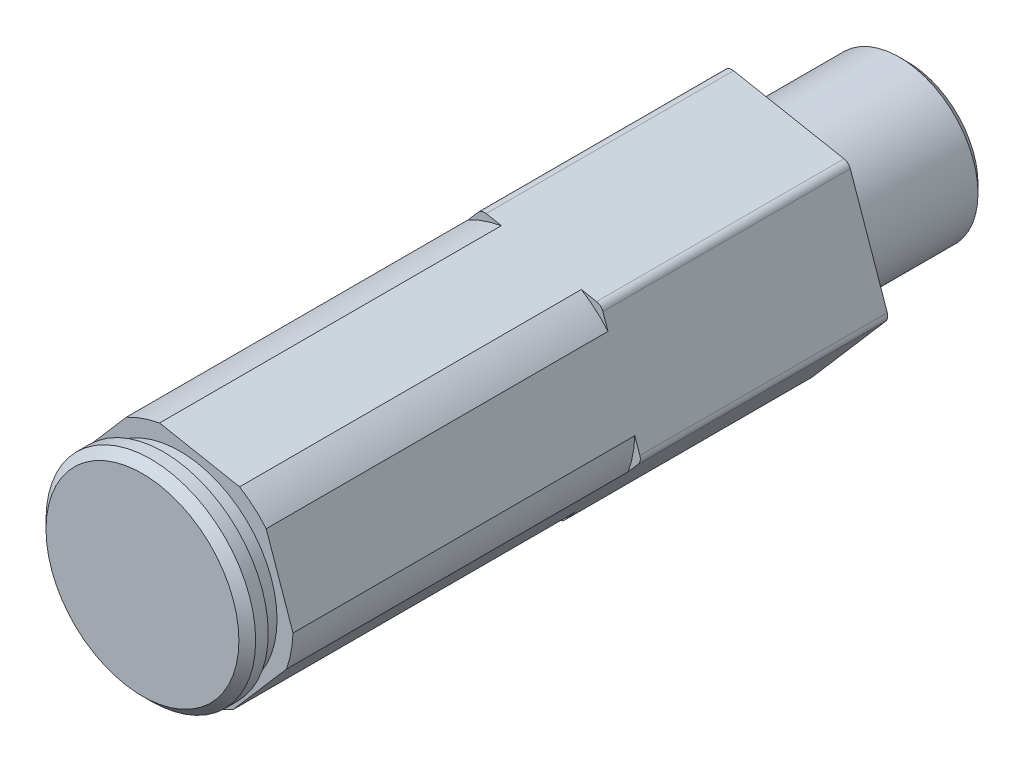
ISO-10303-21;
HEADER;
FILE_DESCRIPTION(('STEP AP214'),'2;1');
FILE_NAME('part.step','',(''),(''),'','','');
FILE_SCHEMA(('AUTOMOTIVE_DESIGN { 1 0 10303 214 1 1 1 1 }'));
ENDSEC;
DATA;
#1=APPLICATION_CONTEXT('core data for automotive mechanical design processes');
#2=APPLICATION_PROTOCOL_DEFINITION('international standard','automotive_design',2000,#1);
#3=PRODUCT_CONTEXT('',#1,'mechanical');
#4=PRODUCT('Part','Part','',(#3));
#5=PRODUCT_RELATED_PRODUCT_CATEGORY('part','',(#4));
#6=PRODUCT_DEFINITION_FORMATION('','',#4);
#7=PRODUCT_DEFINITION_CONTEXT('part definition',#1,'design');
#8=PRODUCT_DEFINITION('design','',#6,#7);
#9=PRODUCT_DEFINITION_SHAPE('','',#8);
#10=(LENGTH_UNIT() NAMED_UNIT(*) SI_UNIT(.MILLI.,.METRE.));
#11=(NAMED_UNIT(*) PLANE_ANGLE_UNIT() SI_UNIT($,.RADIAN.));
#12=(NAMED_UNIT(*) SI_UNIT($,.STERADIAN.) SOLID_ANGLE_UNIT());
#13=UNCERTAINTY_MEASURE_WITH_UNIT(LENGTH_MEASURE(1.E-05),#10,'distance_accuracy_value','');
#14=(GEOMETRIC_REPRESENTATION_CONTEXT(3) GLOBAL_UNCERTAINTY_ASSIGNED_CONTEXT((#13)) GLOBAL_UNIT_ASSIGNED_CONTEXT((#10,
#11,#12)) REPRESENTATION_CONTEXT('',''));
#15=CARTESIAN_POINT('',(0.,0.,0.));
#16=DIRECTION('',(0.,0.,1.));
#17=DIRECTION('',(1.,0.,0.));
#18=AXIS2_PLACEMENT_3D('',#15,#16,#17);
#19=CARTESIAN_POINT('',(0.,0.,23.1775));
#20=DIRECTION('',(0.,0.,1.));
#21=DIRECTION('',(1.,0.,0.));
#22=AXIS2_PLACEMENT_3D('',#19,#20,#21);
#23=CYLINDRICAL_SURFACE('',#22,6.862299966);
#24=CARTESIAN_POINT('',(0.,0.,0.215900000000002));
#25=DIRECTION('',(0.,0.,-1.));
#26=DIRECTION('',(-1.,0.,0.));
#27=AXIS2_PLACEMENT_3D('',#24,#25,#26);
#28=CIRCLE('',#27,6.862299966);
#29=CARTESIAN_POINT('',(6.85862382577054,-0.224588601527918,0.215900000000002));
#30=VERTEX_POINT('',#29);
#31=CARTESIAN_POINT('',(6.45951838185615,-2.31641600275643,0.215900000000005));
#32=VERTEX_POINT('',#31);
#33=EDGE_CURVE('E250',#30,#32,#28,.T.);
#34=ORIENTED_EDGE('',*,*,#33,.F.);
#35=DIRECTION('',(0.,0.,1.));
#36=VECTOR('',#35,1.);
#37=CARTESIAN_POINT('',(6.85862382577054,-0.224588601527918,23.1775));
#38=LINE('',#37,#36);
#39=CARTESIAN_POINT('',(6.85862382577054,-0.224588601527907,20.9169));
#40=VERTEX_POINT('',#39);
#41=EDGE_CURVE('E259',#40,#30,#38,.F.);
#42=ORIENTED_EDGE('',*,*,#41,.F.);
#43=CARTESIAN_POINT('',(0.,0.,20.9169));
#44=DIRECTION('',(0.,0.,1.));
#45=DIRECTION('',(1.,0.,0.));
#46=AXIS2_PLACEMENT_3D('',#43,#44,#45);
#47=CIRCLE('',#46,6.86229996599999);
#48=CARTESIAN_POINT('',(6.45951838185614,-2.31641600275644,20.9169));
#49=VERTEX_POINT('',#48);
#50=EDGE_CURVE('E309',#49,#40,#47,.T.);
#51=ORIENTED_EDGE('',*,*,#50,.F.);
#52=DIRECTION('',(0.,0.,1.));
#53=VECTOR('',#52,1.);
#54=CARTESIAN_POINT('',(6.45951838185615,-2.31641600275643,23.1775));
#55=LINE('',#54,#53);
#56=EDGE_CURVE('E295',#32,#49,#55,.T.);
#57=ORIENTED_EDGE('',*,*,#56,.F.);
#58=EDGE_LOOP('',(#34,#42,#51,#57));
#59=FACE_BOUND('',#58,.T.);
#60=ADVANCED_FACE('F38',(#59),#23,.T.);
#61=CARTESIAN_POINT('',(0.,0.,0.215900000000002));
#62=DIRECTION('',(0.,0.,-1.));
#63=DIRECTION('',(-1.,0.,0.));
#64=AXIS2_PLACEMENT_3D('',#61,#62,#63);
#65=CIRCLE('',#64,6.862299966);
#66=CARTESIAN_POINT('',(3.23481247856167,-6.05203676888246,0.215900000000002));
#67=VERTEX_POINT('',#66);
#68=CARTESIAN_POINT('',(1.2236840868082,-6.75231501627819,0.215900000000005));
#69=VERTEX_POINT('',#68);
#70=EDGE_CURVE('E247',#67,#69,#65,.T.);
#71=ORIENTED_EDGE('',*,*,#70,.F.);
#72=DIRECTION('',(0.,0.,1.));
#73=VECTOR('',#72,1.);
#74=CARTESIAN_POINT('',(3.23481247856167,-6.05203676888246,23.1775));
#75=LINE('',#74,#73);
#76=CARTESIAN_POINT('',(3.23481247856168,-6.05203676888245,20.9169));
#77=VERTEX_POINT('',#76);
#78=EDGE_CURVE('E292',#77,#67,#75,.F.);
#79=ORIENTED_EDGE('',*,*,#78,.F.);
#80=CARTESIAN_POINT('',(1.22368408680819,-6.75231501627819,20.9169));
#81=VERTEX_POINT('',#80);
#82=EDGE_CURVE('E475',#81,#77,#47,.T.);
#83=ORIENTED_EDGE('',*,*,#82,.F.);
#84=DIRECTION('',(0.,0.,1.));
#85=VECTOR('',#84,1.);
#86=CARTESIAN_POINT('',(1.2236840868082,-6.75231501627819,23.1775));
#87=LINE('',#86,#85);
#88=EDGE_CURVE('E288',#69,#81,#87,.T.);
#89=ORIENTED_EDGE('',*,*,#88,.F.);
#90=EDGE_LOOP('',(#71,#79,#83,#89));
#91=FACE_BOUND('',#90,.T.);
#92=ADVANCED_FACE('F504',(#91),#23,.T.);
#93=CARTESIAN_POINT('',(0.,0.,0.215900000000002));
#94=DIRECTION('',(0.,0.,-1.));
#95=DIRECTION('',(-1.,0.,0.));
#96=AXIS2_PLACEMENT_3D('',#93,#94,#95);
#97=CIRCLE('',#96,6.862299966);
#98=CARTESIAN_POINT('',(-3.62381134720887,-5.82744816735454,0.215900000000002));
#99=VERTEX_POINT('',#98);
#100=CARTESIAN_POINT('',(-5.23583429504795,-4.43589901352175,0.215900000000005));
#101=VERTEX_POINT('',#100);
#102=EDGE_CURVE('E244',#99,#101,#97,.T.);
#103=ORIENTED_EDGE('',*,*,#102,.F.);
#104=DIRECTION('',(0.,0.,1.));
#105=VECTOR('',#104,1.);
#106=CARTESIAN_POINT('',(-3.62381134720887,-5.82744816735454,23.1775));
#107=LINE('',#106,#105);
#108=CARTESIAN_POINT('',(-3.62381134720886,-5.82744816735454,20.9169));
#109=VERTEX_POINT('',#108);
#110=EDGE_CURVE('E285',#109,#99,#107,.F.);
#111=ORIENTED_EDGE('',*,*,#110,.F.);
#112=CARTESIAN_POINT('',(-5.23583429504795,-4.43589901352175,20.9169));
#113=VERTEX_POINT('',#112);
#114=EDGE_CURVE('E469',#113,#109,#47,.T.);
#115=ORIENTED_EDGE('',*,*,#114,.F.);
#116=DIRECTION('',(0.,0.,1.));
#117=VECTOR('',#116,1.);
#118=CARTESIAN_POINT('',(-5.23583429504795,-4.43589901352175,23.1775));
#119=LINE('',#118,#117);
#120=EDGE_CURVE('E280',#101,#113,#119,.T.);
#121=ORIENTED_EDGE('',*,*,#120,.F.);
#122=EDGE_LOOP('',(#103,#111,#115,#121));
#123=FACE_BOUND('',#122,.T.);
#124=ADVANCED_FACE('F474',(#123),#23,.T.);
#125=CARTESIAN_POINT('',(0.,0.,0.215900000000002));
#126=DIRECTION('',(0.,0.,-1.));
#127=DIRECTION('',(-1.,0.,0.));
#128=AXIS2_PLACEMENT_3D('',#125,#126,#127);
#129=CIRCLE('',#128,6.862299966);
#130=CARTESIAN_POINT('',(-6.85862382577054,0.224588601527911,0.215900000000002));
#131=VERTEX_POINT('',#130);
#132=CARTESIAN_POINT('',(-6.45951838185614,2.31641600275644,0.215900000000005));
#133=VERTEX_POINT('',#132);
#134=EDGE_CURVE('E225',#131,#133,#129,.T.);
#135=ORIENTED_EDGE('',*,*,#134,.F.);
#136=DIRECTION('',(0.,0.,1.));
#137=VECTOR('',#136,1.);
#138=CARTESIAN_POINT('',(-6.85862382577054,0.224588601527911,23.1775));
#139=LINE('',#138,#137);
#140=CARTESIAN_POINT('',(-6.85862382577053,0.224588601527908,20.9169));
#141=VERTEX_POINT('',#140);
#142=EDGE_CURVE('E277',#141,#131,#139,.F.);
#143=ORIENTED_EDGE('',*,*,#142,.F.);
#144=CARTESIAN_POINT('',(-6.45951838185614,2.31641600275645,20.9169));
#145=VERTEX_POINT('',#144);
#146=EDGE_CURVE('E472',#145,#141,#47,.T.);
#147=ORIENTED_EDGE('',*,*,#146,.F.);
#148=DIRECTION('',(0.,0.,1.));
#149=VECTOR('',#148,1.);
#150=CARTESIAN_POINT('',(-6.45951838185614,2.31641600275644,23.1775));
#151=LINE('',#150,#149);
#152=EDGE_CURVE('E272',#133,#145,#151,.T.);
#153=ORIENTED_EDGE('',*,*,#152,.F.);
#154=EDGE_LOOP('',(#135,#143,#147,#153));
#155=FACE_BOUND('',#154,.T.);
#156=ADVANCED_FACE('F518',(#155),#23,.T.);
#157=CARTESIAN_POINT('',(0.,0.,0.215900000000002));
#158=DIRECTION('',(0.,0.,-1.));
#159=DIRECTION('',(-1.,0.,0.));
#160=AXIS2_PLACEMENT_3D('',#157,#158,#159);
#161=CIRCLE('',#160,6.862299966);
#162=CARTESIAN_POINT('',(-3.23481247856168,6.05203676888246,0.215900000000002));
#163=VERTEX_POINT('',#162);
#164=CARTESIAN_POINT('',(-1.22368408680818,6.75231501627819,0.215900000000005));
#165=VERTEX_POINT('',#164);
#166=EDGE_CURVE('E208',#163,#165,#161,.T.);
#167=ORIENTED_EDGE('',*,*,#166,.F.);
#168=DIRECTION('',(0.,0.,1.));
#169=VECTOR('',#168,1.);
#170=CARTESIAN_POINT('',(-3.23481247856168,6.05203676888246,23.1775));
#171=LINE('',#170,#169);
#172=CARTESIAN_POINT('',(-3.23481247856169,6.05203676888245,20.9169));
#173=VERTEX_POINT('',#172);
#174=EDGE_CURVE('E270',#173,#163,#171,.F.);
#175=ORIENTED_EDGE('',*,*,#174,.F.);
#176=CARTESIAN_POINT('',(-1.22368408680818,6.75231501627819,20.9169));
#177=VERTEX_POINT('',#176);
#178=EDGE_CURVE('E211',#177,#173,#47,.T.);
#179=ORIENTED_EDGE('',*,*,#178,.F.);
#180=DIRECTION('',(0.,0.,1.));
#181=VECTOR('',#180,1.);
#182=CARTESIAN_POINT('',(-1.22368408680819,6.75231501627819,23.1775));
#183=LINE('',#182,#181);
#184=EDGE_CURVE('E204',#165,#177,#183,.T.);
#185=ORIENTED_EDGE('',*,*,#184,.F.);
#186=EDGE_LOOP('',(#167,#175,#179,#185));
#187=FACE_BOUND('',#186,.T.);
#188=ADVANCED_FACE('F206',(#187),#23,.T.);
#189=CARTESIAN_POINT('',(0.,0.,0.215900000000002));
#190=DIRECTION('',(0.,0.,-1.));
#191=DIRECTION('',(-1.,0.,0.));
#192=AXIS2_PLACEMENT_3D('',#189,#190,#191);
#193=CIRCLE('',#192,6.862299966);
#194=CARTESIAN_POINT('',(3.62381134720886,5.82744816735455,0.215900000000002));
#195=VERTEX_POINT('',#194);
#196=CARTESIAN_POINT('',(5.23583429504795,4.43589901352176,0.215900000000005));
#197=VERTEX_POINT('',#196);
#198=EDGE_CURVE('E226',#195,#197,#193,.T.);
#199=ORIENTED_EDGE('',*,*,#198,.F.);
#200=DIRECTION('',(0.,0.,1.));
#201=VECTOR('',#200,1.);
#202=CARTESIAN_POINT('',(3.62381134720886,5.82744816735455,23.1775));
#203=LINE('',#202,#201);
#204=CARTESIAN_POINT('',(3.62381134720885,5.82744816735455,20.9169));
#205=VERTEX_POINT('',#204);
#206=EDGE_CURVE('E216',#205,#195,#203,.F.);
#207=ORIENTED_EDGE('',*,*,#206,.F.);
#208=CARTESIAN_POINT('',(5.23583429504795,4.43589901352175,20.9169));
#209=VERTEX_POINT('',#208);
#210=EDGE_CURVE('E310',#209,#205,#47,.T.);
#211=ORIENTED_EDGE('',*,*,#210,.F.);
#212=DIRECTION('',(0.,0.,1.));
#213=VECTOR('',#212,1.);
#214=CARTESIAN_POINT('',(5.23583429504795,4.43589901352176,23.1775));
#215=LINE('',#214,#213);
#216=EDGE_CURVE('E262',#197,#209,#215,.T.);
#217=ORIENTED_EDGE('',*,*,#216,.F.);
#218=EDGE_LOOP('',(#199,#207,#211,#217));
#219=FACE_BOUND('',#218,.T.);
#220=ADVANCED_FACE('F486',(#219),#23,.T.);
#221=CARTESIAN_POINT('',(0.,4.7625,-14.7701));
#222=DIRECTION('',(0.,0.,1.));
#223=DIRECTION('',(1.,0.,0.));
#224=AXIS2_PLACEMENT_3D('',#221,#222,#223);
#225=PLANE('',#224);
#226=CARTESIAN_POINT('',(0.,0.,-14.7701));
#227=DIRECTION('',(0.,0.,1.));
#228=DIRECTION('',(1.,0.,0.));
#229=AXIS2_PLACEMENT_3D('',#226,#227,#228);
#230=CIRCLE('',#229,4.7625);
#231=CARTESIAN_POINT('',(4.7625,0.,-14.7701));
#232=VERTEX_POINT('',#231);
#233=EDGE_CURVE('E313',#232,#232,#230,.T.);
#234=ORIENTED_EDGE('',*,*,#233,.T.);
#235=EDGE_LOOP('',(#234));
#236=FACE_BOUND('',#235,.T.);
#237=DIRECTION('',(-0.328837014120275,0.944386688885682,0.));
#238=VECTOR('',#237,1.);
#239=CARTESIAN_POINT('',(4.56823802416892,6.35316806990992,-14.7701));
#240=LINE('',#239,#238);
#241=CARTESIAN_POINT('',(7.1664837579922,-1.10873123008568,-14.7701));
#242=VERTEX_POINT('',#241);
#243=CARTESIAN_POINT('',(4.92797436282629,5.32004164207953,-14.7701));
#244=VERTEX_POINT('',#243);
#245=EDGE_CURVE('E264',#242,#244,#240,.T.);
#246=ORIENTED_EDGE('',*,*,#245,.F.);
#247=CARTESIAN_POINT('',(6.68673532003827,-1.27578043325878,-14.7701));
#248=DIRECTION('',(0.,0.,1.));
#249=DIRECTION('',(1.,0.,0.));
#250=AXIS2_PLACEMENT_3D('',#247,#248,#249);
#251=CIRCLE('',#250,0.508);
#252=CARTESIAN_POINT('',(7.07127839264509,-1.60773016636624,-14.7701));
#253=VERTEX_POINT('',#252);
#254=EDGE_CURVE('E355',#242,#253,#251,.F.);
#255=ORIENTED_EDGE('',*,*,#254,.T.);
#256=DIRECTION('',(0.653444356510735,0.756974552375621,0.));
#257=VECTOR('',#256,1.);
#258=CARTESIAN_POINT('',(7.20289199861723,-1.45526400842235,-14.7701));
#259=LINE('',#258,#257);
#260=CARTESIAN_POINT('',(2.62305246777273,-6.76072260527266,-14.7701));
#261=VERTEX_POINT('',#260);
#262=EDGE_CURVE('E297',#261,#253,#259,.T.);
#263=ORIENTED_EDGE('',*,*,#262,.F.);
#264=CARTESIAN_POINT('',(2.23850939516591,-6.4287728721652,-14.7701));
#265=DIRECTION('',(0.,0.,1.));
#266=DIRECTION('',(1.,0.,0.));
#267=AXIS2_PLACEMENT_3D('',#264,#265,#266);
#268=CIRCLE('',#267,0.508);
#269=CARTESIAN_POINT('',(2.1433040298188,-6.92777180844576,-14.7701));
#270=VERTEX_POINT('',#269);
#271=EDGE_CURVE('E347',#261,#270,#268,.F.);
#272=ORIENTED_EDGE('',*,*,#271,.T.);
#273=DIRECTION('',(0.982281370631009,-0.187412136510061,0.));
#274=VECTOR('',#273,1.);
#275=CARTESIAN_POINT('',(-2.07679916236833,-6.12260683312646,-14.7701));
#276=LINE('',#275,#274);
#277=CARTESIAN_POINT('',(-4.54343129021947,-5.65199137518697,-14.7701));
#278=VERTEX_POINT('',#277);
#279=EDGE_CURVE('E290',#278,#270,#276,.T.);
#280=ORIENTED_EDGE('',*,*,#279,.F.);
#281=CARTESIAN_POINT('',(-4.44822592487236,-5.15299243890642,-14.7701));
#282=DIRECTION('',(0.,0.,1.));
#283=DIRECTION('',(1.,0.,0.));
#284=AXIS2_PLACEMENT_3D('',#281,#282,#283);
#285=CIRCLE('',#284,0.508);
#286=CARTESIAN_POINT('',(-4.92797436282629,-5.32004164207952,-14.7701));
#287=VERTEX_POINT('',#286);
#288=EDGE_CURVE('E349',#278,#287,#285,.F.);
#289=ORIENTED_EDGE('',*,*,#288,.T.);
#290=DIRECTION('',(0.328837014120275,-0.944386688885682,0.));
#291=VECTOR('',#290,1.);
#292=CARTESIAN_POINT('',(-7.52622009664957,2.14185765791608,-14.7701));
#293=LINE('',#292,#291);
#294=CARTESIAN_POINT('',(-7.1664837579922,1.10873123008569,-14.7701));
#295=VERTEX_POINT('',#294);
#296=EDGE_CURVE('E282',#295,#287,#293,.T.);
#297=ORIENTED_EDGE('',*,*,#296,.F.);
#298=CARTESIAN_POINT('',(-6.68673532003828,1.27578043325878,-14.7701));
#299=DIRECTION('',(0.,0.,1.));
#300=DIRECTION('',(1.,0.,0.));
#301=AXIS2_PLACEMENT_3D('',#298,#299,#300);
#302=CIRCLE('',#301,0.508);
#303=CARTESIAN_POINT('',(-7.07127839264509,1.60773016636624,-14.7701));
#304=VERTEX_POINT('',#303);
#305=EDGE_CURVE('E351',#295,#304,#302,.F.);
#306=ORIENTED_EDGE('',*,*,#305,.T.);
#307=DIRECTION('',(-0.653444356510735,-0.756974552375621,0.));
#308=VECTOR('',#307,1.);
#309=CARTESIAN_POINT('',(-2.49143886180059,6.91318876321654,-14.7701));
#310=LINE('',#309,#308);
#311=CARTESIAN_POINT('',(-2.62305246777273,6.76072260527266,-14.7701));
#312=VERTEX_POINT('',#311);
#313=EDGE_CURVE('E274',#312,#304,#310,.T.);
#314=ORIENTED_EDGE('',*,*,#313,.F.);
#315=CARTESIAN_POINT('',(-2.23850939516591,6.42877287216521,-14.7701));
#316=DIRECTION('',(0.,0.,1.));
#317=DIRECTION('',(1.,0.,0.));
#318=AXIS2_PLACEMENT_3D('',#315,#316,#317);
#319=CIRCLE('',#318,0.508);
#320=CARTESIAN_POINT('',(-2.1433040298188,6.92777180844576,-14.7701));
#321=VERTEX_POINT('',#320);
#322=EDGE_CURVE('E353',#312,#321,#319,.F.);
#323=ORIENTED_EDGE('',*,*,#322,.T.);
#324=DIRECTION('',(-0.982281370631009,0.187412136510061,0.));
#325=VECTOR('',#324,1.);
#326=CARTESIAN_POINT('',(0.323328098032339,6.45715635050627,-14.7701));
#327=LINE('',#326,#325);
#328=CARTESIAN_POINT('',(4.54343129021947,5.65199137518698,-14.7701));
#329=VERTEX_POINT('',#328);
#330=EDGE_CURVE('E215',#329,#321,#327,.T.);
#331=ORIENTED_EDGE('',*,*,#330,.F.);
#332=CARTESIAN_POINT('',(4.44822592487236,5.15299243890643,-14.7701));
#333=DIRECTION('',(0.,0.,1.));
#334=DIRECTION('',(1.,0.,0.));
#335=AXIS2_PLACEMENT_3D('',#332,#333,#334);
#336=CIRCLE('',#335,0.508);
#337=EDGE_CURVE('E345',#329,#244,#336,.F.);
#338=ORIENTED_EDGE('',*,*,#337,.T.);
#339=EDGE_LOOP('',(#246,#255,#263,#272,#280,#289,#297,#306,#314,#323,#331,#338));
#340=FACE_BOUND('',#339,.T.);
#341=ADVANCED_FACE('F405',(#236,#340),#225,.F.);
#342=CARTESIAN_POINT('',(0.,6.86229996599999,20.9169));
#343=DIRECTION('',(0.,0.,-1.));
#344=DIRECTION('',(-1.,0.,0.));
#345=AXIS2_PLACEMENT_3D('',#342,#343,#344);
#346=PLANE('',#345);
#347=CARTESIAN_POINT('',(0.,0.,20.9169));
#348=DIRECTION('',(0.,0.,1.));
#349=DIRECTION('',(1.,0.,0.));
#350=AXIS2_PLACEMENT_3D('',#347,#348,#349);
#351=CIRCLE('',#350,5.8928);
#352=CARTESIAN_POINT('',(5.8928,0.,20.9169));
#353=VERTEX_POINT('',#352);
#354=EDGE_CURVE('E306',#353,#353,#351,.T.);
#355=ORIENTED_EDGE('',*,*,#354,.F.);
#356=EDGE_LOOP('',(#355));
#357=FACE_BOUND('',#356,.T.);
#358=DIRECTION('',(-0.653444356510735,-0.756974552375621,0.));
#359=VECTOR('',#358,1.);
#360=CARTESIAN_POINT('',(8.24153862712098,-0.252056636816328,20.9169));
#361=LINE('',#360,#359);
#362=EDGE_CURVE('E326',#49,#77,#361,.T.);
#363=ORIENTED_EDGE('',*,*,#362,.F.);
#364=ORIENTED_EDGE('',*,*,#50,.T.);
#365=DIRECTION('',(0.328837014120275,-0.944386688885682,0.));
#366=VECTOR('',#365,1.);
#367=CARTESIAN_POINT('',(3.91614661679637,8.2259087244462,20.9169));
#368=LINE('',#367,#366);
#369=EDGE_CURVE('E316',#209,#40,#368,.T.);
#370=ORIENTED_EDGE('',*,*,#369,.F.);
#371=ORIENTED_EDGE('',*,*,#210,.T.);
#372=DIRECTION('',(0.982281370631009,-0.187412136510061,0.));
#373=VECTOR('',#372,1.);
#374=CARTESIAN_POINT('',(-0.0632271230988614,6.53090827336396,20.9169));
#375=LINE('',#374,#373);
#376=EDGE_CURVE('E318',#177,#205,#375,.T.);
#377=ORIENTED_EDGE('',*,*,#376,.F.);
#378=ORIENTED_EDGE('',*,*,#178,.T.);
#379=DIRECTION('',(0.653444356510735,0.756974552375621,0.));
#380=VECTOR('',#379,1.);
#381=CARTESIAN_POINT('',(-1.45279223329684,8.11639613482257,20.9169));
#382=LINE('',#381,#380);
#383=EDGE_CURVE('E320',#145,#173,#382,.T.);
#384=ORIENTED_EDGE('',*,*,#383,.F.);
#385=ORIENTED_EDGE('',*,*,#146,.T.);
#386=DIRECTION('',(-0.328837014120275,0.944386688885682,0.));
#387=VECTOR('',#386,1.);
#388=CARTESIAN_POINT('',(-8.17831150402212,4.01459831245237,20.9169));
#389=LINE('',#388,#387);
#390=EDGE_CURVE('E322',#113,#141,#389,.T.);
#391=ORIENTED_EDGE('',*,*,#390,.F.);
#392=ORIENTED_EDGE('',*,*,#114,.T.);
#393=DIRECTION('',(-0.982281370631009,0.187412136510061,0.));
#394=VECTOR('',#393,1.);
#395=CARTESIAN_POINT('',(-2.46335438349953,-6.04885491026878,20.9169));
#396=LINE('',#395,#394);
#397=EDGE_CURVE('E324',#81,#109,#396,.T.);
#398=ORIENTED_EDGE('',*,*,#397,.F.);
#399=ORIENTED_EDGE('',*,*,#82,.T.);
#400=EDGE_LOOP('',(#363,#364,#370,#371,#377,#378,#384,#385,#391,#392,#398,#399));
#401=FACE_BOUND('',#400,.T.);
#402=ADVANCED_FACE('F467',(#357,#401),#346,.F.);
#403=CARTESIAN_POINT('',(0.,6.35,23.1775));
#404=DIRECTION('',(0.,0.,-1.));
#405=DIRECTION('',(-1.,0.,0.));
#406=AXIS2_PLACEMENT_3D('',#403,#404,#405);
#407=PLANE('',#406);
#408=CARTESIAN_POINT('',(0.,0.,23.1775));
#409=DIRECTION('',(0.,0.,-1.));
#410=DIRECTION('',(-1.,0.,0.));
#411=AXIS2_PLACEMENT_3D('',#408,#409,#410);
#412=CIRCLE('',#411,5.84199999999999);
#413=CARTESIAN_POINT('',(-5.84199999999999,0.,23.1775));
#414=VERTEX_POINT('',#413);
#415=EDGE_CURVE('E334',#414,#414,#412,.F.);
#416=ORIENTED_EDGE('',*,*,#415,.T.);
#417=EDGE_LOOP('',(#416));
#418=FACE_BOUND('',#417,.T.);
#419=ADVANCED_FACE('F741',(#418),#407,.F.);
#420=CARTESIAN_POINT('',(0.,0.,-23.1775));
#421=DIRECTION('',(0.,0.,1.));
#422=DIRECTION('',(1.,0.,0.));
#423=AXIS2_PLACEMENT_3D('',#420,#421,#422);
#424=PLANE('',#423);
#425=CARTESIAN_POINT('',(0.,0.,-23.1775));
#426=DIRECTION('',(0.,0.,1.));
#427=DIRECTION('',(1.,0.,0.));
#428=AXIS2_PLACEMENT_3D('',#425,#426,#427);
#429=CIRCLE('',#428,4.25450000000001);
#430=CARTESIAN_POINT('',(4.25450000000001,0.,-23.1775));
#431=VERTEX_POINT('',#430);
#432=EDGE_CURVE('E331',#431,#431,#429,.F.);
#433=ORIENTED_EDGE('',*,*,#432,.T.);
#434=EDGE_LOOP('',(#433));
#435=FACE_BOUND('',#434,.T.);
#436=CARTESIAN_POINT('',(0.,0.,-23.1775));
#437=DIRECTION('',(0.,0.,-1.));
#438=DIRECTION('',(-1.,0.,0.));
#439=AXIS2_PLACEMENT_3D('',#436,#437,#438);
#440=CIRCLE('',#439,3.175);
#441=CARTESIAN_POINT('',(-3.175,0.,-23.1775));
#442=VERTEX_POINT('',#441);
#443=EDGE_CURVE('E253',#442,#442,#440,.T.);
#444=ORIENTED_EDGE('',*,*,#443,.F.);
#445=EDGE_LOOP('',(#444));
#446=FACE_BOUND('',#445,.T.);
#447=ADVANCED_FACE('F746',(#435,#446),#424,.F.);
#448=CARTESIAN_POINT('',(0.,0.,23.1775));
#449=DIRECTION('',(0.,0.,1.));
#450=DIRECTION('',(1.,0.,0.));
#451=AXIS2_PLACEMENT_3D('',#448,#449,#450);
#452=CYLINDRICAL_SURFACE('',#451,4.7625);
#453=CARTESIAN_POINT('',(0.,0.,-22.6695));
#454=DIRECTION('',(0.,0.,1.));
#455=DIRECTION('',(1.,0.,0.));
#456=AXIS2_PLACEMENT_3D('',#453,#454,#455);
#457=CIRCLE('',#456,4.7625);
#458=CARTESIAN_POINT('',(4.7625,0.,-22.6695));
#459=VERTEX_POINT('',#458);
#460=EDGE_CURVE('E328',#459,#459,#457,.T.);
#461=ORIENTED_EDGE('',*,*,#460,.T.);
#462=EDGE_LOOP('',(#461));
#463=FACE_BOUND('',#462,.T.);
#464=ORIENTED_EDGE('',*,*,#233,.F.);
#465=EDGE_LOOP('',(#464));
#466=FACE_BOUND('',#465,.T.);
#467=ADVANCED_FACE('F756',(#463,#466),#452,.T.);
#468=CARTESIAN_POINT('',(0.,0.,23.1775));
#469=DIRECTION('',(0.,0.,1.));
#470=DIRECTION('',(1.,0.,0.));
#471=AXIS2_PLACEMENT_3D('',#468,#469,#470);
#472=CYLINDRICAL_SURFACE('',#471,5.8928);
#473=CARTESIAN_POINT('',(0.,0.,21.9075));
#474=DIRECTION('',(0.,0.,1.));
#475=DIRECTION('',(1.,0.,0.));
#476=AXIS2_PLACEMENT_3D('',#473,#474,#475);
#477=CIRCLE('',#476,5.8928);
#478=CARTESIAN_POINT('',(5.8928,0.,21.9075));
#479=VERTEX_POINT('',#478);
#480=EDGE_CURVE('E303',#479,#479,#477,.T.);
#481=ORIENTED_EDGE('',*,*,#480,.F.);
#482=EDGE_LOOP('',(#481));
#483=FACE_BOUND('',#482,.T.);
#484=ORIENTED_EDGE('',*,*,#354,.T.);
#485=EDGE_LOOP('',(#484));
#486=FACE_BOUND('',#485,.T.);
#487=ADVANCED_FACE('F766',(#483,#486),#472,.T.);
#488=CARTESIAN_POINT('',(0.,5.8928,21.9075));
#489=DIRECTION('',(0.,0.,1.));
#490=DIRECTION('',(1.,0.,0.));
#491=AXIS2_PLACEMENT_3D('',#488,#489,#490);
#492=PLANE('',#491);
#493=CARTESIAN_POINT('',(0.,0.,21.9075));
#494=DIRECTION('',(0.,0.,1.));
#495=DIRECTION('',(1.,0.,0.));
#496=AXIS2_PLACEMENT_3D('',#493,#494,#495);
#497=CIRCLE('',#496,6.35);
#498=CARTESIAN_POINT('',(6.35,0.,21.9075));
#499=VERTEX_POINT('',#498);
#500=EDGE_CURVE('E300',#499,#499,#497,.T.);
#501=ORIENTED_EDGE('',*,*,#500,.F.);
#502=EDGE_LOOP('',(#501));
#503=FACE_BOUND('',#502,.T.);
#504=ORIENTED_EDGE('',*,*,#480,.T.);
#505=EDGE_LOOP('',(#504));
#506=FACE_BOUND('',#505,.T.);
#507=ADVANCED_FACE('F777',(#503,#506),#492,.F.);
#508=CARTESIAN_POINT('',(0.,0.,23.1775));
#509=DIRECTION('',(0.,0.,1.));
#510=DIRECTION('',(1.,0.,0.));
#511=AXIS2_PLACEMENT_3D('',#508,#509,#510);
#512=CYLINDRICAL_SURFACE('',#511,6.35);
#513=CARTESIAN_POINT('',(0.,0.,22.6695));
#514=DIRECTION('',(0.,0.,-1.));
#515=DIRECTION('',(-1.,0.,0.));
#516=AXIS2_PLACEMENT_3D('',#513,#514,#515);
#517=CIRCLE('',#516,6.35);
#518=CARTESIAN_POINT('',(-6.35,0.,22.6695));
#519=VERTEX_POINT('',#518);
#520=EDGE_CURVE('E337',#519,#519,#517,.T.);
#521=ORIENTED_EDGE('',*,*,#520,.T.);
#522=EDGE_LOOP('',(#521));
#523=FACE_BOUND('',#522,.T.);
#524=ORIENTED_EDGE('',*,*,#500,.T.);
#525=EDGE_LOOP('',(#524));
#526=FACE_BOUND('',#525,.T.);
#527=ADVANCED_FACE('F667',(#523,#526),#512,.T.);
#528=CARTESIAN_POINT('',(7.2629296604121,-1.38571411988168,-23.1775));
#529=DIRECTION('',(0.944386688885682,0.328837014120275,0.));
#530=DIRECTION('',(-0.328837014120275,0.944386688885682,0.));
#531=AXIS2_PLACEMENT_3D('',#528,#529,#530);
#532=PLANE('',#531);
#533=DIRECTION('',(-0.328837014120275,0.944386688885682,0.));
#534=VECTOR('',#533,1.);
#535=CARTESIAN_POINT('',(4.83152846040639,5.59702453187553,0.215900000000005));
#536=LINE('',#535,#534);
#537=CARTESIAN_POINT('',(7.1664837579922,-1.10873123008568,0.215900000000005));
#538=VERTEX_POINT('',#537);
#539=EDGE_CURVE('E240',#538,#30,#536,.T.);
#540=ORIENTED_EDGE('',*,*,#539,.F.);
#541=DIRECTION('',(0.,0.,-1.));
#542=VECTOR('',#541,1.);
#543=CARTESIAN_POINT('',(7.1664837579922,-1.10873123008568,-23.1775));
#544=LINE('',#543,#542);
#545=EDGE_CURVE('E342',#538,#242,#544,.T.);
#546=ORIENTED_EDGE('',*,*,#545,.T.);
#547=ORIENTED_EDGE('',*,*,#245,.T.);
#548=DIRECTION('',(0.,0.,-1.));
#549=VECTOR('',#548,1.);
#550=CARTESIAN_POINT('',(4.92797436282629,5.32004164207953,-23.1775));
#551=LINE('',#550,#549);
#552=CARTESIAN_POINT('',(4.92797436282629,5.32004164207953,0.215900000000005));
#553=VERTEX_POINT('',#552);
#554=EDGE_CURVE('E340',#244,#553,#551,.F.);
#555=ORIENTED_EDGE('',*,*,#554,.T.);
#556=EDGE_CURVE('E234',#197,#553,#536,.T.);
#557=ORIENTED_EDGE('',*,*,#556,.F.);
#558=ORIENTED_EDGE('',*,*,#216,.T.);
#559=ORIENTED_EDGE('',*,*,#369,.T.);
#560=ORIENTED_EDGE('',*,*,#41,.T.);
#561=EDGE_LOOP('',(#540,#546,#547,#555,#557,#558,#559,#560));
#562=FACE_BOUND('',#561,.T.);
#563=ADVANCED_FACE('F439',(#562),#532,.T.);
#564=CARTESIAN_POINT('',(4.83152846040638,5.59702453187553,-23.1775));
#565=DIRECTION('',(0.187412136510061,0.982281370631009,0.));
#566=DIRECTION('',(-0.982281370631009,0.187412136510061,0.));
#567=AXIS2_PLACEMENT_3D('',#564,#565,#566);
#568=PLANE('',#567);
#569=ORIENTED_EDGE('',*,*,#330,.T.);
#570=DIRECTION('',(0.,0.,-1.));
#571=VECTOR('',#570,1.);
#572=CARTESIAN_POINT('',(-2.1433040298188,6.92777180844576,-23.1775));
#573=LINE('',#572,#571);
#574=CARTESIAN_POINT('',(-2.1433040298188,6.92777180844576,0.215900000000005));
#575=VERTEX_POINT('',#574);
#576=EDGE_CURVE('E231',#321,#575,#573,.F.);
#577=ORIENTED_EDGE('',*,*,#576,.T.);
#578=DIRECTION('',(-0.982281370631009,0.187412136510061,0.));
#579=VECTOR('',#578,1.);
#580=CARTESIAN_POINT('',(-2.43140120000572,6.98273865175721,0.215900000000005));
#581=LINE('',#580,#579);
#582=EDGE_CURVE('E221',#165,#575,#581,.T.);
#583=ORIENTED_EDGE('',*,*,#582,.F.);
#584=ORIENTED_EDGE('',*,*,#184,.T.);
#585=ORIENTED_EDGE('',*,*,#376,.T.);
#586=ORIENTED_EDGE('',*,*,#206,.T.);
#587=CARTESIAN_POINT('',(4.54343129021947,5.65199137518698,0.215900000000005));
#588=VERTEX_POINT('',#587);
#589=EDGE_CURVE('E232',#588,#195,#581,.T.);
#590=ORIENTED_EDGE('',*,*,#589,.F.);
#591=DIRECTION('',(0.,0.,-1.));
#592=VECTOR('',#591,1.);
#593=CARTESIAN_POINT('',(4.54343129021947,5.65199137518698,-23.1775));
#594=LINE('',#593,#592);
#595=EDGE_CURVE('E369',#588,#329,#594,.T.);
#596=ORIENTED_EDGE('',*,*,#595,.T.);
#597=EDGE_LOOP('',(#569,#577,#583,#584,#585,#586,#590,#596));
#598=FACE_BOUND('',#597,.T.);
#599=ADVANCED_FACE('F229',(#598),#568,.T.);
#600=CARTESIAN_POINT('',(-2.43140120000572,6.98273865175721,-23.1775));
#601=DIRECTION('',(-0.756974552375621,0.653444356510735,0.));
#602=DIRECTION('',(-0.653444356510735,-0.756974552375621,0.));
#603=AXIS2_PLACEMENT_3D('',#600,#601,#602);
#604=PLANE('',#603);
#605=DIRECTION('',(-0.653444356510735,-0.756974552375621,0.));
#606=VECTOR('',#605,1.);
#607=CARTESIAN_POINT('',(-7.2629296604121,1.38571411988169,0.215900000000005));
#608=LINE('',#607,#606);
#609=CARTESIAN_POINT('',(-2.62305246777273,6.76072260527266,0.215900000000005));
#610=VERTEX_POINT('',#609);
#611=EDGE_CURVE('E224',#610,#163,#608,.T.);
#612=ORIENTED_EDGE('',*,*,#611,.F.);
#613=DIRECTION('',(0.,0.,-1.));
#614=VECTOR('',#613,1.);
#615=CARTESIAN_POINT('',(-2.62305246777273,6.76072260527266,-23.1775));
#616=LINE('',#615,#614);
#617=EDGE_CURVE('E366',#610,#312,#616,.T.);
#618=ORIENTED_EDGE('',*,*,#617,.T.);
#619=ORIENTED_EDGE('',*,*,#313,.T.);
#620=DIRECTION('',(0.,0.,-1.));
#621=VECTOR('',#620,1.);
#622=CARTESIAN_POINT('',(-7.07127839264509,1.60773016636624,-23.1775));
#623=LINE('',#622,#621);
#624=CARTESIAN_POINT('',(-7.07127839264509,1.60773016636624,0.215900000000005));
#625=VERTEX_POINT('',#624);
#626=EDGE_CURVE('E364',#304,#625,#623,.F.);
#627=ORIENTED_EDGE('',*,*,#626,.T.);
#628=EDGE_CURVE('E235',#133,#625,#608,.T.);
#629=ORIENTED_EDGE('',*,*,#628,.F.);
#630=ORIENTED_EDGE('',*,*,#152,.T.);
#631=ORIENTED_EDGE('',*,*,#383,.T.);
#632=ORIENTED_EDGE('',*,*,#174,.T.);
#633=EDGE_LOOP('',(#612,#618,#619,#627,#629,#630,#631,#632));
#634=FACE_BOUND('',#633,.T.);
#635=ADVANCED_FACE('F425',(#634),#604,.T.);
#636=CARTESIAN_POINT('',(-7.2629296604121,1.38571411988169,-23.1775));
#637=DIRECTION('',(-0.944386688885682,-0.328837014120275,0.));
#638=DIRECTION('',(0.328837014120275,-0.944386688885682,0.));
#639=AXIS2_PLACEMENT_3D('',#636,#637,#638);
#640=PLANE('',#639);
#641=DIRECTION('',(0.328837014120275,-0.944386688885682,0.));
#642=VECTOR('',#641,1.);
#643=CARTESIAN_POINT('',(-4.83152846040639,-5.59702453187552,0.215900000000005));
#644=LINE('',#643,#642);
#645=CARTESIAN_POINT('',(-7.1664837579922,1.10873123008569,0.215900000000005));
#646=VERTEX_POINT('',#645);
#647=EDGE_CURVE('E418',#646,#131,#644,.T.);
#648=ORIENTED_EDGE('',*,*,#647,.F.);
#649=DIRECTION('',(0.,0.,-1.));
#650=VECTOR('',#649,1.);
#651=CARTESIAN_POINT('',(-7.1664837579922,1.10873123008568,-23.1775));
#652=LINE('',#651,#650);
#653=EDGE_CURVE('E377',#646,#295,#652,.T.);
#654=ORIENTED_EDGE('',*,*,#653,.T.);
#655=ORIENTED_EDGE('',*,*,#296,.T.);
#656=DIRECTION('',(0.,0.,-1.));
#657=VECTOR('',#656,1.);
#658=CARTESIAN_POINT('',(-4.92797436282629,-5.32004164207952,-23.1775));
#659=LINE('',#658,#657);
#660=CARTESIAN_POINT('',(-4.92797436282629,-5.32004164207952,0.215900000000005));
#661=VERTEX_POINT('',#660);
#662=EDGE_CURVE('E375',#287,#661,#659,.F.);
#663=ORIENTED_EDGE('',*,*,#662,.T.);
#664=EDGE_CURVE('E454',#101,#661,#644,.T.);
#665=ORIENTED_EDGE('',*,*,#664,.F.);
#666=ORIENTED_EDGE('',*,*,#120,.T.);
#667=ORIENTED_EDGE('',*,*,#390,.T.);
#668=ORIENTED_EDGE('',*,*,#142,.T.);
#669=EDGE_LOOP('',(#648,#654,#655,#663,#665,#666,#667,#668));
#670=FACE_BOUND('',#669,.T.);
#671=ADVANCED_FACE('F415',(#670),#640,.T.);
#672=CARTESIAN_POINT('',(-4.83152846040639,-5.59702453187552,-23.1775));
#673=DIRECTION('',(-0.187412136510061,-0.982281370631009,0.));
#674=DIRECTION('',(0.982281370631009,-0.187412136510061,0.));
#675=AXIS2_PLACEMENT_3D('',#672,#673,#674);
#676=PLANE('',#675);
#677=DIRECTION('',(0.982281370631009,-0.187412136510061,0.));
#678=VECTOR('',#677,1.);
#679=CARTESIAN_POINT('',(2.43140120000572,-6.98273865175721,0.215900000000005));
#680=LINE('',#679,#678);
#681=CARTESIAN_POINT('',(-4.54343129021948,-5.65199137518697,0.215900000000005));
#682=VERTEX_POINT('',#681);
#683=EDGE_CURVE('E408',#682,#99,#680,.T.);
#684=ORIENTED_EDGE('',*,*,#683,.F.);
#685=DIRECTION('',(0.,0.,-1.));
#686=VECTOR('',#685,1.);
#687=CARTESIAN_POINT('',(-4.54343129021947,-5.65199137518697,-23.1775));
#688=LINE('',#687,#686);
#689=EDGE_CURVE('E383',#682,#278,#688,.T.);
#690=ORIENTED_EDGE('',*,*,#689,.T.);
#691=ORIENTED_EDGE('',*,*,#279,.T.);
#692=DIRECTION('',(0.,0.,-1.));
#693=VECTOR('',#692,1.);
#694=CARTESIAN_POINT('',(2.1433040298188,-6.92777180844576,-23.1775));
#695=LINE('',#694,#693);
#696=CARTESIAN_POINT('',(2.1433040298188,-6.92777180844576,0.215900000000005));
#697=VERTEX_POINT('',#696);
#698=EDGE_CURVE('E61',#270,#697,#695,.F.);
#699=ORIENTED_EDGE('',*,*,#698,.T.);
#700=EDGE_CURVE('E392',#69,#697,#680,.T.);
#701=ORIENTED_EDGE('',*,*,#700,.F.);
#702=ORIENTED_EDGE('',*,*,#88,.T.);
#703=ORIENTED_EDGE('',*,*,#397,.T.);
#704=ORIENTED_EDGE('',*,*,#110,.T.);
#705=EDGE_LOOP('',(#684,#690,#691,#699,#701,#702,#703,#704));
#706=FACE_BOUND('',#705,.T.);
#707=ADVANCED_FACE('F406',(#706),#676,.T.);
#708=CARTESIAN_POINT('',(2.43140120000572,-6.98273865175721,-23.1775));
#709=DIRECTION('',(0.756974552375621,-0.653444356510735,0.));
#710=DIRECTION('',(0.653444356510735,0.756974552375621,0.));
#711=AXIS2_PLACEMENT_3D('',#708,#709,#710);
#712=PLANE('',#711);
#713=ORIENTED_EDGE('',*,*,#262,.T.);
#714=DIRECTION('',(0.,0.,-1.));
#715=VECTOR('',#714,1.);
#716=CARTESIAN_POINT('',(7.07127839264509,-1.60773016636623,-23.1775));
#717=LINE('',#716,#715);
#718=CARTESIAN_POINT('',(7.07127839264509,-1.60773016636624,0.215900000000005));
#719=VERTEX_POINT('',#718);
#720=EDGE_CURVE('E360',#253,#719,#717,.F.);
#721=ORIENTED_EDGE('',*,*,#720,.T.);
#722=DIRECTION('',(0.653444356510735,0.756974552375621,0.));
#723=VECTOR('',#722,1.);
#724=CARTESIAN_POINT('',(7.2629296604121,-1.38571411988168,0.215900000000005));
#725=LINE('',#724,#723);
#726=EDGE_CURVE('E399',#32,#719,#725,.T.);
#727=ORIENTED_EDGE('',*,*,#726,.F.);
#728=ORIENTED_EDGE('',*,*,#56,.T.);
#729=ORIENTED_EDGE('',*,*,#362,.T.);
#730=ORIENTED_EDGE('',*,*,#78,.T.);
#731=CARTESIAN_POINT('',(2.62305246777273,-6.76072260527266,0.215900000000005));
#732=VERTEX_POINT('',#731);
#733=EDGE_CURVE('E390',#732,#67,#725,.T.);
#734=ORIENTED_EDGE('',*,*,#733,.F.);
#735=DIRECTION('',(0.,0.,-1.));
#736=VECTOR('',#735,1.);
#737=CARTESIAN_POINT('',(2.62305246777273,-6.76072260527266,-23.1775));
#738=LINE('',#737,#736);
#739=EDGE_CURVE('E357',#732,#261,#738,.T.);
#740=ORIENTED_EDGE('',*,*,#739,.T.);
#741=EDGE_LOOP('',(#713,#721,#727,#728,#729,#730,#734,#740));
#742=FACE_BOUND('',#741,.T.);
#743=ADVANCED_FACE('F396',(#742),#712,.T.);
#744=CARTESIAN_POINT('',(0.,0.,-14.4399));
#745=DIRECTION('',(0.,0.,-1.));
#746=DIRECTION('',(-1.,0.,0.));
#747=AXIS2_PLACEMENT_3D('',#744,#745,#746);
#748=CONICAL_SURFACE('',#747,3.175,1.02974425867665);
#749=CARTESIAN_POINT('',(0.,0.,-12.5321675345875));
#750=VERTEX_POINT('',#749);
#751=VERTEX_LOOP('',#750);
#752=FACE_BOUND('',#751,.T.);
#753=CARTESIAN_POINT('',(0.,0.,-14.4399));
#754=DIRECTION('',(0.,0.,-1.));
#755=DIRECTION('',(-1.,0.,0.));
#756=AXIS2_PLACEMENT_3D('',#753,#754,#755);
#757=CIRCLE('',#756,3.175);
#758=CARTESIAN_POINT('',(-3.175,0.,-14.4399));
#759=VERTEX_POINT('',#758);
#760=EDGE_CURVE('E256',#759,#759,#757,.T.);
#761=ORIENTED_EDGE('',*,*,#760,.T.);
#762=EDGE_LOOP('',(#761));
#763=FACE_BOUND('',#762,.T.);
#764=ADVANCED_FACE('F615',(#752,#763),#748,.F.);
#765=CARTESIAN_POINT('',(0.,0.,-23.1775));
#766=DIRECTION('',(0.,0.,-1.));
#767=DIRECTION('',(-1.,0.,0.));
#768=AXIS2_PLACEMENT_3D('',#765,#766,#767);
#769=CYLINDRICAL_SURFACE('',#768,3.175);
#770=ORIENTED_EDGE('',*,*,#443,.T.);
#771=EDGE_LOOP('',(#770));
#772=FACE_BOUND('',#771,.T.);
#773=ORIENTED_EDGE('',*,*,#760,.F.);
#774=EDGE_LOOP('',(#773));
#775=FACE_BOUND('',#774,.T.);
#776=ADVANCED_FACE('F718',(#772,#775),#769,.F.);
#777=CARTESIAN_POINT('',(0.,0.,-22.6695));
#778=DIRECTION('',(0.,0.,1.));
#779=DIRECTION('',(1.,0.,0.));
#780=AXIS2_PLACEMENT_3D('',#777,#778,#779);
#781=CONICAL_SURFACE('',#780,4.7625,0.785398163397452);
#782=ORIENTED_EDGE('',*,*,#432,.F.);
#783=EDGE_LOOP('',(#782));
#784=FACE_BOUND('',#783,.T.);
#785=ORIENTED_EDGE('',*,*,#460,.F.);
#786=EDGE_LOOP('',(#785));
#787=FACE_BOUND('',#786,.T.);
#788=ADVANCED_FACE('F498',(#784,#787),#781,.T.);
#789=CARTESIAN_POINT('',(0.,0.,23.1775));
#790=DIRECTION('',(0.,0.,-1.));
#791=DIRECTION('',(-1.,0.,0.));
#792=AXIS2_PLACEMENT_3D('',#789,#790,#791);
#793=CONICAL_SURFACE('',#792,5.84199999999999,0.785398163397448);
#794=ORIENTED_EDGE('',*,*,#520,.F.);
#795=EDGE_LOOP('',(#794));
#796=FACE_BOUND('',#795,.T.);
#797=ORIENTED_EDGE('',*,*,#415,.F.);
#798=EDGE_LOOP('',(#797));
#799=FACE_BOUND('',#798,.T.);
#800=ADVANCED_FACE('F491',(#796,#799),#793,.T.);
#801=CARTESIAN_POINT('',(0.,6.86229996599999,0.215900000000002));
#802=DIRECTION('',(0.,0.,-1.));
#803=DIRECTION('',(-1.,0.,0.));
#804=AXIS2_PLACEMENT_3D('',#801,#802,#803);
#805=PLANE('',#804);
#806=ORIENTED_EDGE('',*,*,#556,.T.);
#807=CARTESIAN_POINT('',(4.44822592487236,5.15299243890643,0.215900000000002));
#808=DIRECTION('',(0.,0.,-1.));
#809=DIRECTION('',(-1.,0.,0.));
#810=AXIS2_PLACEMENT_3D('',#807,#808,#809);
#811=CIRCLE('',#810,0.508);
#812=EDGE_CURVE('E13',#553,#588,#811,.F.);
#813=ORIENTED_EDGE('',*,*,#812,.T.);
#814=ORIENTED_EDGE('',*,*,#589,.T.);
#815=ORIENTED_EDGE('',*,*,#198,.T.);
#816=EDGE_LOOP('',(#806,#813,#814,#815));
#817=FACE_BOUND('',#816,.T.);
#818=ADVANCED_FACE('F489',(#817),#805,.F.);
#819=ORIENTED_EDGE('',*,*,#582,.T.);
#820=CARTESIAN_POINT('',(-2.23850939516591,6.42877287216521,0.215900000000002));
#821=DIRECTION('',(0.,0.,-1.));
#822=DIRECTION('',(-1.,0.,0.));
#823=AXIS2_PLACEMENT_3D('',#820,#821,#822);
#824=CIRCLE('',#823,0.508);
#825=EDGE_CURVE('E373',#575,#610,#824,.F.);
#826=ORIENTED_EDGE('',*,*,#825,.T.);
#827=ORIENTED_EDGE('',*,*,#611,.T.);
#828=ORIENTED_EDGE('',*,*,#166,.T.);
#829=EDGE_LOOP('',(#819,#826,#827,#828));
#830=FACE_BOUND('',#829,.T.);
#831=ADVANCED_FACE('F220',(#830),#805,.F.);
#832=ORIENTED_EDGE('',*,*,#628,.T.);
#833=CARTESIAN_POINT('',(-6.68673532003828,1.27578043325878,0.215900000000002));
#834=DIRECTION('',(0.,0.,-1.));
#835=DIRECTION('',(-1.,0.,0.));
#836=AXIS2_PLACEMENT_3D('',#833,#834,#835);
#837=CIRCLE('',#836,0.508);
#838=EDGE_CURVE('E380',#625,#646,#837,.F.);
#839=ORIENTED_EDGE('',*,*,#838,.T.);
#840=ORIENTED_EDGE('',*,*,#647,.T.);
#841=ORIENTED_EDGE('',*,*,#134,.T.);
#842=EDGE_LOOP('',(#832,#839,#840,#841));
#843=FACE_BOUND('',#842,.T.);
#844=ADVANCED_FACE('F497',(#843),#805,.F.);
#845=ORIENTED_EDGE('',*,*,#664,.T.);
#846=CARTESIAN_POINT('',(-4.44822592487236,-5.15299243890642,0.215900000000002));
#847=DIRECTION('',(0.,0.,-1.));
#848=DIRECTION('',(-1.,0.,0.));
#849=AXIS2_PLACEMENT_3D('',#846,#847,#848);
#850=CIRCLE('',#849,0.508);
#851=EDGE_CURVE('E53',#661,#682,#850,.F.);
#852=ORIENTED_EDGE('',*,*,#851,.T.);
#853=ORIENTED_EDGE('',*,*,#683,.T.);
#854=ORIENTED_EDGE('',*,*,#102,.T.);
#855=EDGE_LOOP('',(#845,#852,#853,#854));
#856=FACE_BOUND('',#855,.T.);
#857=ADVANCED_FACE('F457',(#856),#805,.F.);
#858=ORIENTED_EDGE('',*,*,#700,.T.);
#859=CARTESIAN_POINT('',(2.23850939516591,-6.4287728721652,0.215900000000002));
#860=DIRECTION('',(0.,0.,-1.));
#861=DIRECTION('',(-1.,0.,0.));
#862=AXIS2_PLACEMENT_3D('',#859,#860,#861);
#863=CIRCLE('',#862,0.508);
#864=EDGE_CURVE('E46',#697,#732,#863,.F.);
#865=ORIENTED_EDGE('',*,*,#864,.T.);
#866=ORIENTED_EDGE('',*,*,#733,.T.);
#867=ORIENTED_EDGE('',*,*,#70,.T.);
#868=EDGE_LOOP('',(#858,#865,#866,#867));
#869=FACE_BOUND('',#868,.T.);
#870=ADVANCED_FACE('F389',(#869),#805,.F.);
#871=ORIENTED_EDGE('',*,*,#726,.T.);
#872=CARTESIAN_POINT('',(6.68673532003827,-1.27578043325878,0.215900000000002));
#873=DIRECTION('',(0.,0.,-1.));
#874=DIRECTION('',(-1.,0.,0.));
#875=AXIS2_PLACEMENT_3D('',#872,#873,#874);
#876=CIRCLE('',#875,0.508);
#877=EDGE_CURVE('E362',#719,#538,#876,.F.);
#878=ORIENTED_EDGE('',*,*,#877,.T.);
#879=ORIENTED_EDGE('',*,*,#539,.T.);
#880=ORIENTED_EDGE('',*,*,#33,.T.);
#881=EDGE_LOOP('',(#871,#878,#879,#880));
#882=FACE_BOUND('',#881,.T.);
#883=ADVANCED_FACE('F450',(#882),#805,.F.);
#884=CARTESIAN_POINT('',(6.68673532003827,-1.27578043325878,-23.1775));
#885=DIRECTION('',(0.,0.,-1.));
#886=DIRECTION('',(-1.,0.,0.));
#887=AXIS2_PLACEMENT_3D('',#884,#885,#886);
#888=CYLINDRICAL_SURFACE('',#887,0.508);
#889=ORIENTED_EDGE('',*,*,#877,.F.);
#890=ORIENTED_EDGE('',*,*,#720,.F.);
#891=ORIENTED_EDGE('',*,*,#254,.F.);
#892=ORIENTED_EDGE('',*,*,#545,.F.);
#893=EDGE_LOOP('',(#889,#890,#891,#892));
#894=FACE_BOUND('',#893,.T.);
#895=ADVANCED_FACE('F445',(#894),#888,.T.);
#896=CARTESIAN_POINT('',(-2.23850939516591,6.42877287216521,-23.1775));
#897=DIRECTION('',(0.,0.,-1.));
#898=DIRECTION('',(-1.,0.,0.));
#899=AXIS2_PLACEMENT_3D('',#896,#897,#898);
#900=CYLINDRICAL_SURFACE('',#899,0.508);
#901=ORIENTED_EDGE('',*,*,#825,.F.);
#902=ORIENTED_EDGE('',*,*,#576,.F.);
#903=ORIENTED_EDGE('',*,*,#322,.F.);
#904=ORIENTED_EDGE('',*,*,#617,.F.);
#905=EDGE_LOOP('',(#901,#902,#903,#904));
#906=FACE_BOUND('',#905,.T.);
#907=ADVANCED_FACE('F430',(#906),#900,.T.);
#908=CARTESIAN_POINT('',(-6.68673532003828,1.27578043325878,-23.1775));
#909=DIRECTION('',(0.,0.,-1.));
#910=DIRECTION('',(-1.,0.,0.));
#911=AXIS2_PLACEMENT_3D('',#908,#909,#910);
#912=CYLINDRICAL_SURFACE('',#911,0.508);
#913=ORIENTED_EDGE('',*,*,#838,.F.);
#914=ORIENTED_EDGE('',*,*,#626,.F.);
#915=ORIENTED_EDGE('',*,*,#305,.F.);
#916=ORIENTED_EDGE('',*,*,#653,.F.);
#917=EDGE_LOOP('',(#913,#914,#915,#916));
#918=FACE_BOUND('',#917,.T.);
#919=ADVANCED_FACE('F421',(#918),#912,.T.);
#920=CARTESIAN_POINT('',(-4.44822592487236,-5.15299243890642,-23.1775));
#921=DIRECTION('',(0.,0.,-1.));
#922=DIRECTION('',(-1.,0.,0.));
#923=AXIS2_PLACEMENT_3D('',#920,#921,#922);
#924=CYLINDRICAL_SURFACE('',#923,0.508);
#925=ORIENTED_EDGE('',*,*,#851,.F.);
#926=ORIENTED_EDGE('',*,*,#662,.F.);
#927=ORIENTED_EDGE('',*,*,#288,.F.);
#928=ORIENTED_EDGE('',*,*,#689,.F.);
#929=EDGE_LOOP('',(#925,#926,#927,#928));
#930=FACE_BOUND('',#929,.T.);
#931=ADVANCED_FACE('F410',(#930),#924,.T.);
#932=CARTESIAN_POINT('',(2.23850939516591,-6.4287728721652,-23.1775));
#933=DIRECTION('',(0.,0.,-1.));
#934=DIRECTION('',(-1.,0.,0.));
#935=AXIS2_PLACEMENT_3D('',#932,#933,#934);
#936=CYLINDRICAL_SURFACE('',#935,0.508);
#937=ORIENTED_EDGE('',*,*,#864,.F.);
#938=ORIENTED_EDGE('',*,*,#698,.F.);
#939=ORIENTED_EDGE('',*,*,#271,.F.);
#940=ORIENTED_EDGE('',*,*,#739,.F.);
#941=EDGE_LOOP('',(#937,#938,#939,#940));
#942=FACE_BOUND('',#941,.T.);
#943=ADVANCED_FACE('F401',(#942),#936,.T.);
#944=CARTESIAN_POINT('',(4.44822592487236,5.15299243890643,-23.1775));
#945=DIRECTION('',(0.,0.,-1.));
#946=DIRECTION('',(-1.,0.,0.));
#947=AXIS2_PLACEMENT_3D('',#944,#945,#946);
#948=CYLINDRICAL_SURFACE('',#947,0.508);
#949=ORIENTED_EDGE('',*,*,#812,.F.);
#950=ORIENTED_EDGE('',*,*,#554,.F.);
#951=ORIENTED_EDGE('',*,*,#337,.F.);
#952=ORIENTED_EDGE('',*,*,#595,.F.);
#953=EDGE_LOOP('',(#949,#950,#951,#952));
#954=FACE_BOUND('',#953,.T.);
#955=ADVANCED_FACE('F40',(#954),#948,.T.);
#956=CLOSED_SHELL('',(#60,#92,#124,#156,#188,#220,#341,#402,#419,#447,#467,#487,#507,#527,#563,
#599,#635,#671,#707,#743,#764,#776,#788,#800,#818,#831,#844,#857,#870,#883,#895,#907,#919,#931,
#943,#955));
#957=MANIFOLD_SOLID_BREP('B2',#956);
#958=ADVANCED_BREP_SHAPE_REPRESENTATION('',(#18,#957),#14);
#959=SHAPE_DEFINITION_REPRESENTATION(#9,#958);
ENDSEC;
END-ISO-10303-21;
